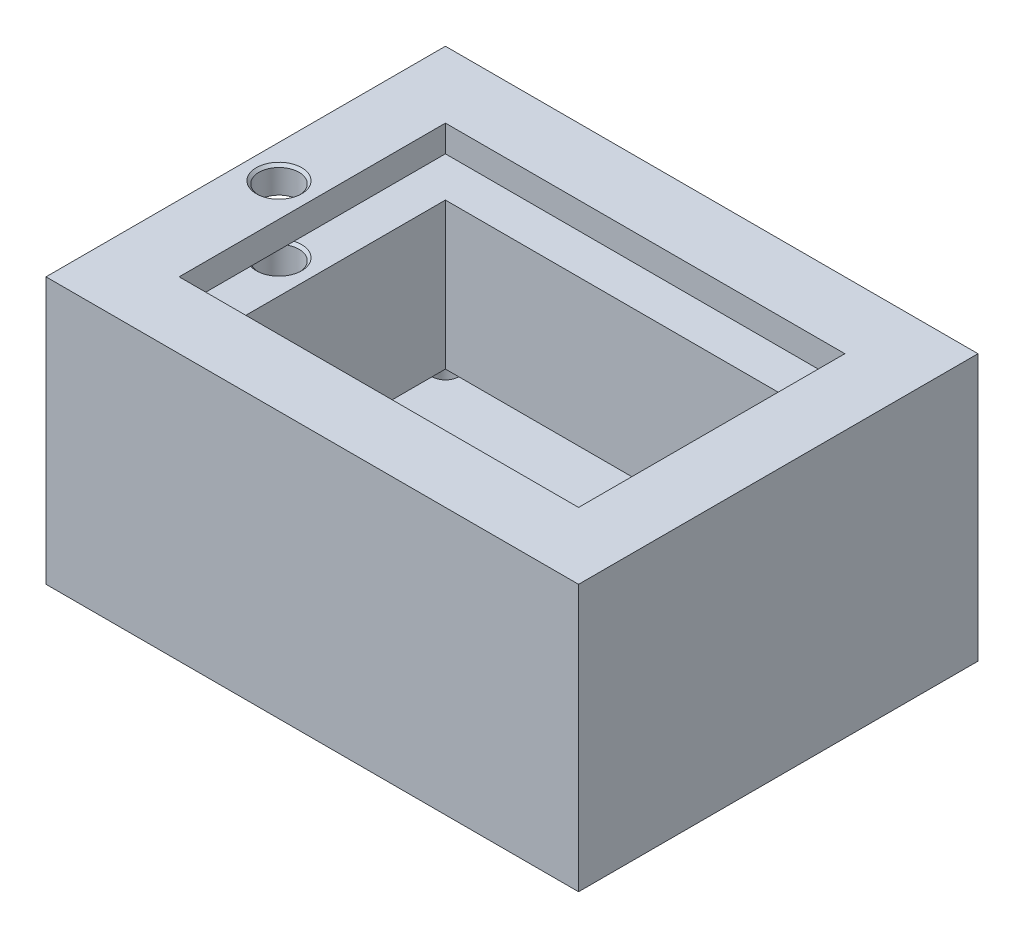
ISO-10303-21;
HEADER;
FILE_DESCRIPTION(('STEP AP214'),'2;1');
FILE_NAME('part.step','',(''),(''),'','','');
FILE_SCHEMA(('AUTOMOTIVE_DESIGN { 1 0 10303 214 1 1 1 1 }'));
ENDSEC;
DATA;
#1=APPLICATION_CONTEXT('core data for automotive mechanical design processes');
#2=APPLICATION_PROTOCOL_DEFINITION('international standard','automotive_design',2000,#1);
#3=PRODUCT_CONTEXT('',#1,'mechanical');
#4=PRODUCT('Part','Part','',(#3));
#5=PRODUCT_RELATED_PRODUCT_CATEGORY('part','',(#4));
#6=PRODUCT_DEFINITION_FORMATION('','',#4);
#7=PRODUCT_DEFINITION_CONTEXT('part definition',#1,'design');
#8=PRODUCT_DEFINITION('design','',#6,#7);
#9=PRODUCT_DEFINITION_SHAPE('','',#8);
#10=(LENGTH_UNIT() NAMED_UNIT(*) SI_UNIT(.MILLI.,.METRE.));
#11=(NAMED_UNIT(*) PLANE_ANGLE_UNIT() SI_UNIT($,.RADIAN.));
#12=(NAMED_UNIT(*) SI_UNIT($,.STERADIAN.) SOLID_ANGLE_UNIT());
#13=UNCERTAINTY_MEASURE_WITH_UNIT(LENGTH_MEASURE(1.E-05),#10,'distance_accuracy_value','');
#14=(GEOMETRIC_REPRESENTATION_CONTEXT(3) GLOBAL_UNCERTAINTY_ASSIGNED_CONTEXT((#13)) GLOBAL_UNIT_ASSIGNED_CONTEXT((#10,
#11,#12)) REPRESENTATION_CONTEXT('',''));
#15=CARTESIAN_POINT('',(0.,0.,0.));
#16=DIRECTION('',(0.,0.,1.));
#17=DIRECTION('',(1.,0.,0.));
#18=AXIS2_PLACEMENT_3D('',#15,#16,#17);
#19=CARTESIAN_POINT('',(19.05,5.08,12.7));
#20=DIRECTION('',(1.,0.,0.));
#21=DIRECTION('',(0.,0.,-1.));
#22=AXIS2_PLACEMENT_3D('',#19,#20,#21);
#23=PLANE('',#22);
#24=DIRECTION('',(0.,1.,0.));
#25=VECTOR('',#24,1.);
#26=CARTESIAN_POINT('',(19.05,5.08,-12.7));
#27=LINE('',#26,#25);
#28=CARTESIAN_POINT('',(19.05,22.86,-12.7));
#29=VERTEX_POINT('',#28);
#30=CARTESIAN_POINT('',(19.05,25.4,-12.7));
#31=VERTEX_POINT('',#30);
#32=EDGE_CURVE('E217',#29,#31,#27,.T.);
#33=ORIENTED_EDGE('',*,*,#32,.F.);
#34=DIRECTION('',(0.,0.,1.));
#35=VECTOR('',#34,1.);
#36=CARTESIAN_POINT('',(19.05,22.86,12.7));
#37=LINE('',#36,#35);
#38=CARTESIAN_POINT('',(19.05,22.86,12.7));
#39=VERTEX_POINT('',#38);
#40=EDGE_CURVE('E228',#29,#39,#37,.T.);
#41=ORIENTED_EDGE('',*,*,#40,.T.);
#42=DIRECTION('',(0.,1.,0.));
#43=VECTOR('',#42,1.);
#44=CARTESIAN_POINT('',(19.05,5.08,12.7));
#45=LINE('',#44,#43);
#46=CARTESIAN_POINT('',(19.05,25.4,12.7));
#47=VERTEX_POINT('',#46);
#48=EDGE_CURVE('E239',#39,#47,#45,.T.);
#49=ORIENTED_EDGE('',*,*,#48,.T.);
#50=DIRECTION('',(0.,0.,-1.));
#51=VECTOR('',#50,1.);
#52=CARTESIAN_POINT('',(19.05,25.4,12.7));
#53=LINE('',#52,#51);
#54=EDGE_CURVE('E222',#47,#31,#53,.T.);
#55=ORIENTED_EDGE('',*,*,#54,.T.);
#56=EDGE_LOOP('',(#33,#41,#49,#55));
#57=FACE_BOUND('',#56,.T.);
#58=ADVANCED_FACE('F45',(#57),#23,.F.);
#59=CARTESIAN_POINT('',(-19.05,5.08,12.7));
#60=DIRECTION('',(0.,0.,1.));
#61=DIRECTION('',(1.,0.,0.));
#62=AXIS2_PLACEMENT_3D('',#59,#60,#61);
#63=PLANE('',#62);
#64=ORIENTED_EDGE('',*,*,#48,.F.);
#65=DIRECTION('',(-1.,0.,0.));
#66=VECTOR('',#65,1.);
#67=CARTESIAN_POINT('',(-19.05,22.86,12.7));
#68=LINE('',#67,#66);
#69=CARTESIAN_POINT('',(-19.05,22.86,12.7));
#70=VERTEX_POINT('',#69);
#71=EDGE_CURVE('E365',#39,#70,#68,.T.);
#72=ORIENTED_EDGE('',*,*,#71,.T.);
#73=DIRECTION('',(0.,1.,0.));
#74=VECTOR('',#73,1.);
#75=CARTESIAN_POINT('',(-19.05,5.08,12.7));
#76=LINE('',#75,#74);
#77=CARTESIAN_POINT('',(-19.05,25.4,12.7));
#78=VERTEX_POINT('',#77);
#79=EDGE_CURVE('E242',#70,#78,#76,.T.);
#80=ORIENTED_EDGE('',*,*,#79,.T.);
#81=DIRECTION('',(1.,0.,0.));
#82=VECTOR('',#81,1.);
#83=CARTESIAN_POINT('',(-19.05,25.4,12.7));
#84=LINE('',#83,#82);
#85=EDGE_CURVE('E235',#78,#47,#84,.T.);
#86=ORIENTED_EDGE('',*,*,#85,.T.);
#87=EDGE_LOOP('',(#64,#72,#80,#86));
#88=FACE_BOUND('',#87,.T.);
#89=ADVANCED_FACE('F307',(#88),#63,.F.);
#90=CARTESIAN_POINT('',(-19.05,5.08,12.7));
#91=DIRECTION('',(-1.,0.,0.));
#92=DIRECTION('',(0.,0.,1.));
#93=AXIS2_PLACEMENT_3D('',#90,#91,#92);
#94=PLANE('',#93);
#95=ORIENTED_EDGE('',*,*,#79,.F.);
#96=DIRECTION('',(0.,0.,-1.));
#97=VECTOR('',#96,1.);
#98=CARTESIAN_POINT('',(-19.05,22.86,12.7));
#99=LINE('',#98,#97);
#100=CARTESIAN_POINT('',(-19.05,22.86,-12.7));
#101=VERTEX_POINT('',#100);
#102=EDGE_CURVE('E353',#70,#101,#99,.T.);
#103=ORIENTED_EDGE('',*,*,#102,.T.);
#104=DIRECTION('',(0.,1.,0.));
#105=VECTOR('',#104,1.);
#106=CARTESIAN_POINT('',(-19.05,5.08,-12.7));
#107=LINE('',#106,#105);
#108=CARTESIAN_POINT('',(-19.05,25.4,-12.7));
#109=VERTEX_POINT('',#108);
#110=EDGE_CURVE('E246',#101,#109,#107,.T.);
#111=ORIENTED_EDGE('',*,*,#110,.T.);
#112=DIRECTION('',(0.,0.,1.));
#113=VECTOR('',#112,1.);
#114=CARTESIAN_POINT('',(-19.05,25.4,12.7));
#115=LINE('',#114,#113);
#116=EDGE_CURVE('E230',#109,#78,#115,.T.);
#117=ORIENTED_EDGE('',*,*,#116,.T.);
#118=EDGE_LOOP('',(#95,#103,#111,#117));
#119=FACE_BOUND('',#118,.T.);
#120=ADVANCED_FACE('F320',(#119),#94,.F.);
#121=CARTESIAN_POINT('',(-19.05,5.08,-12.7));
#122=DIRECTION('',(0.,0.,-1.));
#123=DIRECTION('',(-1.,0.,0.));
#124=AXIS2_PLACEMENT_3D('',#121,#122,#123);
#125=PLANE('',#124);
#126=ORIENTED_EDGE('',*,*,#110,.F.);
#127=DIRECTION('',(1.,0.,0.));
#128=VECTOR('',#127,1.);
#129=CARTESIAN_POINT('',(-19.05,22.86,-12.7));
#130=LINE('',#129,#128);
#131=EDGE_CURVE('E278',#101,#29,#130,.T.);
#132=ORIENTED_EDGE('',*,*,#131,.T.);
#133=ORIENTED_EDGE('',*,*,#32,.T.);
#134=DIRECTION('',(-1.,0.,0.));
#135=VECTOR('',#134,1.);
#136=CARTESIAN_POINT('',(-19.05,25.4,-12.7));
#137=LINE('',#136,#135);
#138=EDGE_CURVE('E225',#31,#109,#137,.T.);
#139=ORIENTED_EDGE('',*,*,#138,.T.);
#140=EDGE_LOOP('',(#126,#132,#133,#139));
#141=FACE_BOUND('',#140,.T.);
#142=ADVANCED_FACE('F380',(#141),#125,.F.);
#143=CARTESIAN_POINT('',(25.4,25.4,19.05));
#144=DIRECTION('',(-1.,0.,0.));
#145=DIRECTION('',(0.,0.,1.));
#146=AXIS2_PLACEMENT_3D('',#143,#144,#145);
#147=PLANE('',#146);
#148=DIRECTION('',(0.,0.,-1.));
#149=VECTOR('',#148,1.);
#150=CARTESIAN_POINT('',(25.4,0.,19.05));
#151=LINE('',#150,#149);
#152=CARTESIAN_POINT('',(25.4,0.,19.05));
#153=VERTEX_POINT('',#152);
#154=CARTESIAN_POINT('',(25.4,0.,-19.05));
#155=VERTEX_POINT('',#154);
#156=EDGE_CURVE('E237',#153,#155,#151,.T.);
#157=ORIENTED_EDGE('',*,*,#156,.T.);
#158=DIRECTION('',(0.,-1.,0.));
#159=VECTOR('',#158,1.);
#160=CARTESIAN_POINT('',(25.4,25.4,-19.05));
#161=LINE('',#160,#159);
#162=CARTESIAN_POINT('',(25.4,25.4,-19.05));
#163=VERTEX_POINT('',#162);
#164=EDGE_CURVE('E273',#163,#155,#161,.T.);
#165=ORIENTED_EDGE('',*,*,#164,.F.);
#166=DIRECTION('',(0.,0.,-1.));
#167=VECTOR('',#166,1.);
#168=CARTESIAN_POINT('',(25.4,25.4,19.05));
#169=LINE('',#168,#167);
#170=CARTESIAN_POINT('',(25.4,25.4,19.05));
#171=VERTEX_POINT('',#170);
#172=EDGE_CURVE('E248',#171,#163,#169,.T.);
#173=ORIENTED_EDGE('',*,*,#172,.F.);
#174=DIRECTION('',(0.,-1.,0.));
#175=VECTOR('',#174,1.);
#176=CARTESIAN_POINT('',(25.4,25.4,19.05));
#177=LINE('',#176,#175);
#178=EDGE_CURVE('E256',#171,#153,#177,.T.);
#179=ORIENTED_EDGE('',*,*,#178,.T.);
#180=EDGE_LOOP('',(#157,#165,#173,#179));
#181=FACE_BOUND('',#180,.T.);
#182=ADVANCED_FACE('F383',(#181),#147,.F.);
#183=CARTESIAN_POINT('',(-25.4,25.4,-19.05));
#184=DIRECTION('',(0.,0.,1.));
#185=DIRECTION('',(1.,0.,0.));
#186=AXIS2_PLACEMENT_3D('',#183,#184,#185);
#187=PLANE('',#186);
#188=DIRECTION('',(-1.,0.,0.));
#189=VECTOR('',#188,1.);
#190=CARTESIAN_POINT('',(-25.4,0.,-19.05));
#191=LINE('',#190,#189);
#192=CARTESIAN_POINT('',(-25.4,0.,-19.05));
#193=VERTEX_POINT('',#192);
#194=EDGE_CURVE('E261',#155,#193,#191,.T.);
#195=ORIENTED_EDGE('',*,*,#194,.T.);
#196=DIRECTION('',(0.,-1.,0.));
#197=VECTOR('',#196,1.);
#198=CARTESIAN_POINT('',(-25.4,25.4,-19.05));
#199=LINE('',#198,#197);
#200=CARTESIAN_POINT('',(-25.4,25.4,-19.05));
#201=VERTEX_POINT('',#200);
#202=EDGE_CURVE('E275',#201,#193,#199,.T.);
#203=ORIENTED_EDGE('',*,*,#202,.F.);
#204=DIRECTION('',(-1.,0.,0.));
#205=VECTOR('',#204,1.);
#206=CARTESIAN_POINT('',(-25.4,25.4,-19.05));
#207=LINE('',#206,#205);
#208=EDGE_CURVE('E255',#163,#201,#207,.T.);
#209=ORIENTED_EDGE('',*,*,#208,.F.);
#210=ORIENTED_EDGE('',*,*,#164,.T.);
#211=EDGE_LOOP('',(#195,#203,#209,#210));
#212=FACE_BOUND('',#211,.T.);
#213=ADVANCED_FACE('F511',(#212),#187,.F.);
#214=CARTESIAN_POINT('',(-25.4,25.4,19.05));
#215=DIRECTION('',(1.,0.,0.));
#216=DIRECTION('',(0.,0.,-1.));
#217=AXIS2_PLACEMENT_3D('',#214,#215,#216);
#218=PLANE('',#217);
#219=DIRECTION('',(0.,0.,1.));
#220=VECTOR('',#219,1.);
#221=CARTESIAN_POINT('',(-25.4,19.04238,16.51762));
#222=LINE('',#221,#220);
#223=CARTESIAN_POINT('',(-25.4,19.04238,-16.51762));
#224=VERTEX_POINT('',#223);
#225=CARTESIAN_POINT('',(-25.4,19.04238,16.51762));
#226=VERTEX_POINT('',#225);
#227=EDGE_CURVE('E441',#224,#226,#222,.T.);
#228=ORIENTED_EDGE('',*,*,#227,.F.);
#229=DIRECTION('',(0.,-1.,0.));
#230=VECTOR('',#229,1.);
#231=CARTESIAN_POINT('',(-25.4,19.04238,-16.51762));
#232=LINE('',#231,#230);
#233=CARTESIAN_POINT('',(-25.4,22.86,-16.51762));
#234=VERTEX_POINT('',#233);
#235=EDGE_CURVE('E424',#234,#224,#232,.T.);
#236=ORIENTED_EDGE('',*,*,#235,.F.);
#237=DIRECTION('',(0.,0.,-1.));
#238=VECTOR('',#237,1.);
#239=CARTESIAN_POINT('',(-25.4,22.86,-16.51762));
#240=LINE('',#239,#238);
#241=CARTESIAN_POINT('',(-25.4,22.86,16.51762));
#242=VERTEX_POINT('',#241);
#243=EDGE_CURVE('E427',#242,#234,#240,.T.);
#244=ORIENTED_EDGE('',*,*,#243,.F.);
#245=DIRECTION('',(0.,1.,0.));
#246=VECTOR('',#245,1.);
#247=CARTESIAN_POINT('',(-25.4,22.86,16.51762));
#248=LINE('',#247,#246);
#249=EDGE_CURVE('E443',#226,#242,#248,.T.);
#250=ORIENTED_EDGE('',*,*,#249,.F.);
#251=EDGE_LOOP('',(#228,#236,#244,#250));
#252=FACE_BOUND('',#251,.T.);
#253=DIRECTION('',(0.,0.,1.));
#254=VECTOR('',#253,1.);
#255=CARTESIAN_POINT('',(-25.4,0.,19.05));
#256=LINE('',#255,#254);
#257=CARTESIAN_POINT('',(-25.4,0.,19.05));
#258=VERTEX_POINT('',#257);
#259=EDGE_CURVE('E263',#193,#258,#256,.T.);
#260=ORIENTED_EDGE('',*,*,#259,.T.);
#261=DIRECTION('',(0.,-1.,0.));
#262=VECTOR('',#261,1.);
#263=CARTESIAN_POINT('',(-25.4,25.4,19.05));
#264=LINE('',#263,#262);
#265=CARTESIAN_POINT('',(-25.4,25.4,19.05));
#266=VERTEX_POINT('',#265);
#267=EDGE_CURVE('E268',#266,#258,#264,.T.);
#268=ORIENTED_EDGE('',*,*,#267,.F.);
#269=DIRECTION('',(0.,0.,1.));
#270=VECTOR('',#269,1.);
#271=CARTESIAN_POINT('',(-25.4,25.4,19.05));
#272=LINE('',#271,#270);
#273=EDGE_CURVE('E253',#201,#266,#272,.T.);
#274=ORIENTED_EDGE('',*,*,#273,.F.);
#275=ORIENTED_EDGE('',*,*,#202,.T.);
#276=EDGE_LOOP('',(#260,#268,#274,#275));
#277=FACE_BOUND('',#276,.T.);
#278=ADVANCED_FACE('F461',(#252,#277),#218,.F.);
#279=CARTESIAN_POINT('',(-25.4,25.4,19.05));
#280=DIRECTION('',(0.,0.,-1.));
#281=DIRECTION('',(-1.,0.,0.));
#282=AXIS2_PLACEMENT_3D('',#279,#280,#281);
#283=PLANE('',#282);
#284=DIRECTION('',(1.,0.,0.));
#285=VECTOR('',#284,1.);
#286=CARTESIAN_POINT('',(-25.4,0.,19.05));
#287=LINE('',#286,#285);
#288=EDGE_CURVE('E254',#258,#153,#287,.T.);
#289=ORIENTED_EDGE('',*,*,#288,.T.);
#290=ORIENTED_EDGE('',*,*,#178,.F.);
#291=DIRECTION('',(1.,0.,0.));
#292=VECTOR('',#291,1.);
#293=CARTESIAN_POINT('',(-25.4,25.4,19.05));
#294=LINE('',#293,#292);
#295=EDGE_CURVE('E260',#266,#171,#294,.T.);
#296=ORIENTED_EDGE('',*,*,#295,.F.);
#297=ORIENTED_EDGE('',*,*,#267,.T.);
#298=EDGE_LOOP('',(#289,#290,#296,#297));
#299=FACE_BOUND('',#298,.T.);
#300=ADVANCED_FACE('F514',(#299),#283,.F.);
#301=CARTESIAN_POINT('',(0.,25.4,0.));
#302=DIRECTION('',(0.,-1.,0.));
#303=DIRECTION('',(0.,0.,-1.));
#304=AXIS2_PLACEMENT_3D('',#301,#302,#303);
#305=PLANE('',#304);
#306=CARTESIAN_POINT('',(-22.225,25.4,0.));
#307=DIRECTION('',(0.,-1.,0.));
#308=DIRECTION('',(0.,0.,-1.));
#309=AXIS2_PLACEMENT_3D('',#306,#307,#308);
#310=CIRCLE('',#309,2.16281);
#311=CARTESIAN_POINT('',(-22.225,25.4,-2.16281000000001));
#312=VERTEX_POINT('',#311);
#313=EDGE_CURVE('E286',#312,#312,#310,.T.);
#314=ORIENTED_EDGE('',*,*,#313,.T.);
#315=EDGE_LOOP('',(#314));
#316=FACE_BOUND('',#315,.T.);
#317=ORIENTED_EDGE('',*,*,#138,.F.);
#318=ORIENTED_EDGE('',*,*,#54,.F.);
#319=ORIENTED_EDGE('',*,*,#85,.F.);
#320=ORIENTED_EDGE('',*,*,#116,.F.);
#321=EDGE_LOOP('',(#317,#318,#319,#320));
#322=FACE_BOUND('',#321,.T.);
#323=ORIENTED_EDGE('',*,*,#172,.T.);
#324=ORIENTED_EDGE('',*,*,#208,.T.);
#325=ORIENTED_EDGE('',*,*,#273,.T.);
#326=ORIENTED_EDGE('',*,*,#295,.T.);
#327=EDGE_LOOP('',(#323,#324,#325,#326));
#328=FACE_BOUND('',#327,.T.);
#329=ADVANCED_FACE('F373',(#316,#322,#328),#305,.F.);
#330=CARTESIAN_POINT('',(0.,0.,0.));
#331=DIRECTION('',(0.,-1.,0.));
#332=DIRECTION('',(0.,0.,-1.));
#333=AXIS2_PLACEMENT_3D('',#330,#331,#332);
#334=PLANE('',#333);
#335=CARTESIAN_POINT('',(19.05,0.,-12.7));
#336=DIRECTION('',(0.,-1.,0.));
#337=DIRECTION('',(0.,0.,-1.));
#338=AXIS2_PLACEMENT_3D('',#335,#336,#337);
#339=CIRCLE('',#338,1.27);
#340=CARTESIAN_POINT('',(19.05,0.,-13.97));
#341=VERTEX_POINT('',#340);
#342=EDGE_CURVE('E409',#341,#341,#339,.F.);
#343=ORIENTED_EDGE('',*,*,#342,.T.);
#344=EDGE_LOOP('',(#343));
#345=FACE_BOUND('',#344,.T.);
#346=CARTESIAN_POINT('',(-19.05,0.,12.7));
#347=DIRECTION('',(0.,-1.,0.));
#348=DIRECTION('',(0.,0.,-1.));
#349=AXIS2_PLACEMENT_3D('',#346,#347,#348);
#350=CIRCLE('',#349,1.27);
#351=CARTESIAN_POINT('',(-19.05,0.,11.43));
#352=VERTEX_POINT('',#351);
#353=EDGE_CURVE('E415',#352,#352,#350,.F.);
#354=ORIENTED_EDGE('',*,*,#353,.T.);
#355=EDGE_LOOP('',(#354));
#356=FACE_BOUND('',#355,.T.);
#357=CARTESIAN_POINT('',(19.05,0.,12.7));
#358=DIRECTION('',(0.,-1.,0.));
#359=DIRECTION('',(0.,0.,-1.));
#360=AXIS2_PLACEMENT_3D('',#357,#358,#359);
#361=CIRCLE('',#360,1.27);
#362=CARTESIAN_POINT('',(19.05,0.,11.43));
#363=VERTEX_POINT('',#362);
#364=EDGE_CURVE('E404',#363,#363,#361,.F.);
#365=ORIENTED_EDGE('',*,*,#364,.T.);
#366=EDGE_LOOP('',(#365));
#367=FACE_BOUND('',#366,.T.);
#368=CARTESIAN_POINT('',(-19.05,0.,-12.7));
#369=DIRECTION('',(0.,-1.,0.));
#370=DIRECTION('',(0.,0.,-1.));
#371=AXIS2_PLACEMENT_3D('',#368,#369,#370);
#372=CIRCLE('',#371,1.27);
#373=CARTESIAN_POINT('',(-19.05,0.,-13.97));
#374=VERTEX_POINT('',#373);
#375=EDGE_CURVE('E187',#374,#374,#372,.F.);
#376=ORIENTED_EDGE('',*,*,#375,.T.);
#377=EDGE_LOOP('',(#376));
#378=FACE_BOUND('',#377,.T.);
#379=ORIENTED_EDGE('',*,*,#156,.F.);
#380=ORIENTED_EDGE('',*,*,#288,.F.);
#381=ORIENTED_EDGE('',*,*,#259,.F.);
#382=ORIENTED_EDGE('',*,*,#194,.F.);
#383=EDGE_LOOP('',(#379,#380,#381,#382));
#384=FACE_BOUND('',#383,.T.);
#385=ADVANCED_FACE('F474',(#345,#356,#367,#378,#384),#334,.T.);
#386=CARTESIAN_POINT('',(22.87524,22.86,-16.51762));
#387=DIRECTION('',(0.,1.,0.));
#388=DIRECTION('',(0.,0.,1.));
#389=AXIS2_PLACEMENT_3D('',#386,#387,#388);
#390=PLANE('',#389);
#391=CARTESIAN_POINT('',(-22.225,22.86,0.));
#392=DIRECTION('',(0.,1.,0.));
#393=DIRECTION('',(0.,0.,1.));
#394=AXIS2_PLACEMENT_3D('',#391,#392,#393);
#395=CIRCLE('',#394,1.90881);
#396=CARTESIAN_POINT('',(-22.225,22.86,1.90881));
#397=VERTEX_POINT('',#396);
#398=EDGE_CURVE('E422',#397,#397,#395,.T.);
#399=ORIENTED_EDGE('',*,*,#398,.T.);
#400=EDGE_LOOP('',(#399));
#401=FACE_BOUND('',#400,.T.);
#402=ORIENTED_EDGE('',*,*,#243,.T.);
#403=DIRECTION('',(-1.,0.,0.));
#404=VECTOR('',#403,1.);
#405=CARTESIAN_POINT('',(22.87524,22.86,-16.51762));
#406=LINE('',#405,#404);
#407=CARTESIAN_POINT('',(22.87524,22.86,-16.51762));
#408=VERTEX_POINT('',#407);
#409=EDGE_CURVE('E358',#408,#234,#406,.T.);
#410=ORIENTED_EDGE('',*,*,#409,.F.);
#411=DIRECTION('',(0.,0.,-1.));
#412=VECTOR('',#411,1.);
#413=CARTESIAN_POINT('',(22.87524,22.86,-16.51762));
#414=LINE('',#413,#412);
#415=CARTESIAN_POINT('',(22.87524,22.86,16.51762));
#416=VERTEX_POINT('',#415);
#417=EDGE_CURVE('E436',#416,#408,#414,.T.);
#418=ORIENTED_EDGE('',*,*,#417,.F.);
#419=DIRECTION('',(-1.,0.,0.));
#420=VECTOR('',#419,1.);
#421=CARTESIAN_POINT('',(22.87524,22.86,16.51762));
#422=LINE('',#421,#420);
#423=EDGE_CURVE('E448',#416,#242,#422,.T.);
#424=ORIENTED_EDGE('',*,*,#423,.T.);
#425=EDGE_LOOP('',(#402,#410,#418,#424));
#426=FACE_BOUND('',#425,.T.);
#427=ORIENTED_EDGE('',*,*,#131,.F.);
#428=ORIENTED_EDGE('',*,*,#102,.F.);
#429=ORIENTED_EDGE('',*,*,#71,.F.);
#430=ORIENTED_EDGE('',*,*,#40,.F.);
#431=EDGE_LOOP('',(#427,#428,#429,#430));
#432=FACE_BOUND('',#431,.T.);
#433=ADVANCED_FACE('F377',(#401,#426,#432),#390,.F.);
#434=CARTESIAN_POINT('',(22.87524,19.04238,16.51762));
#435=DIRECTION('',(0.,-1.,0.));
#436=DIRECTION('',(0.,0.,-1.));
#437=AXIS2_PLACEMENT_3D('',#434,#435,#436);
#438=PLANE('',#437);
#439=CARTESIAN_POINT('',(-22.225,19.04238,0.));
#440=DIRECTION('',(0.,-1.,0.));
#441=DIRECTION('',(0.,0.,-1.));
#442=AXIS2_PLACEMENT_3D('',#439,#440,#441);
#443=CIRCLE('',#442,2.16280999999999);
#444=CARTESIAN_POINT('',(-22.225,19.04238,-2.16281));
#445=VERTEX_POINT('',#444);
#446=EDGE_CURVE('E51',#445,#445,#443,.T.);
#447=ORIENTED_EDGE('',*,*,#446,.T.);
#448=EDGE_LOOP('',(#447));
#449=FACE_BOUND('',#448,.T.);
#450=ORIENTED_EDGE('',*,*,#227,.T.);
#451=DIRECTION('',(-1.,0.,0.));
#452=VECTOR('',#451,1.);
#453=CARTESIAN_POINT('',(22.87524,19.04238,16.51762));
#454=LINE('',#453,#452);
#455=CARTESIAN_POINT('',(22.87524,19.04238,16.51762));
#456=VERTEX_POINT('',#455);
#457=EDGE_CURVE('E455',#456,#226,#454,.T.);
#458=ORIENTED_EDGE('',*,*,#457,.F.);
#459=DIRECTION('',(0.,0.,1.));
#460=VECTOR('',#459,1.);
#461=CARTESIAN_POINT('',(22.87524,19.04238,16.51762));
#462=LINE('',#461,#460);
#463=CARTESIAN_POINT('',(22.87524,19.04238,-16.51762));
#464=VERTEX_POINT('',#463);
#465=EDGE_CURVE('E429',#464,#456,#462,.T.);
#466=ORIENTED_EDGE('',*,*,#465,.F.);
#467=DIRECTION('',(-1.,0.,0.));
#468=VECTOR('',#467,1.);
#469=CARTESIAN_POINT('',(22.87524,19.04238,-16.51762));
#470=LINE('',#469,#468);
#471=EDGE_CURVE('E437',#464,#224,#470,.T.);
#472=ORIENTED_EDGE('',*,*,#471,.T.);
#473=EDGE_LOOP('',(#450,#458,#466,#472));
#474=FACE_BOUND('',#473,.T.);
#475=DIRECTION('',(1.,0.,0.));
#476=VECTOR('',#475,1.);
#477=CARTESIAN_POINT('',(-19.05,19.04238,12.7));
#478=LINE('',#477,#476);
#479=CARTESIAN_POINT('',(-19.05,19.04238,12.7));
#480=VERTEX_POINT('',#479);
#481=CARTESIAN_POINT('',(19.05,19.04238,12.7));
#482=VERTEX_POINT('',#481);
#483=EDGE_CURVE('E346',#480,#482,#478,.T.);
#484=ORIENTED_EDGE('',*,*,#483,.F.);
#485=DIRECTION('',(0.,0.,1.));
#486=VECTOR('',#485,1.);
#487=CARTESIAN_POINT('',(-19.05,19.04238,12.7));
#488=LINE('',#487,#486);
#489=CARTESIAN_POINT('',(-19.05,19.04238,-12.7));
#490=VERTEX_POINT('',#489);
#491=EDGE_CURVE('E352',#490,#480,#488,.T.);
#492=ORIENTED_EDGE('',*,*,#491,.F.);
#493=DIRECTION('',(-1.,0.,0.));
#494=VECTOR('',#493,1.);
#495=CARTESIAN_POINT('',(-19.05,19.04238,-12.7));
#496=LINE('',#495,#494);
#497=CARTESIAN_POINT('',(19.05,19.04238,-12.7));
#498=VERTEX_POINT('',#497);
#499=EDGE_CURVE('E279',#498,#490,#496,.T.);
#500=ORIENTED_EDGE('',*,*,#499,.F.);
#501=DIRECTION('',(0.,0.,-1.));
#502=VECTOR('',#501,1.);
#503=CARTESIAN_POINT('',(19.05,19.04238,12.7));
#504=LINE('',#503,#502);
#505=EDGE_CURVE('E338',#482,#498,#504,.T.);
#506=ORIENTED_EDGE('',*,*,#505,.F.);
#507=EDGE_LOOP('',(#484,#492,#500,#506));
#508=FACE_BOUND('',#507,.T.);
#509=ADVANCED_FACE('F293',(#449,#474,#508),#438,.F.);
#510=CARTESIAN_POINT('',(22.87524,19.04238,-16.51762));
#511=DIRECTION('',(0.,0.,-1.));
#512=DIRECTION('',(-1.,0.,0.));
#513=AXIS2_PLACEMENT_3D('',#510,#511,#512);
#514=PLANE('',#513);
#515=ORIENTED_EDGE('',*,*,#235,.T.);
#516=ORIENTED_EDGE('',*,*,#471,.F.);
#517=DIRECTION('',(0.,-1.,0.));
#518=VECTOR('',#517,1.);
#519=CARTESIAN_POINT('',(22.87524,19.04238,-16.51762));
#520=LINE('',#519,#518);
#521=EDGE_CURVE('E428',#408,#464,#520,.T.);
#522=ORIENTED_EDGE('',*,*,#521,.F.);
#523=ORIENTED_EDGE('',*,*,#409,.T.);
#524=EDGE_LOOP('',(#515,#516,#522,#523));
#525=FACE_BOUND('',#524,.T.);
#526=ADVANCED_FACE('F468',(#525),#514,.F.);
#527=CARTESIAN_POINT('',(22.87524,22.86,16.51762));
#528=DIRECTION('',(0.,0.,1.));
#529=DIRECTION('',(1.,0.,0.));
#530=AXIS2_PLACEMENT_3D('',#527,#528,#529);
#531=PLANE('',#530);
#532=ORIENTED_EDGE('',*,*,#249,.T.);
#533=ORIENTED_EDGE('',*,*,#423,.F.);
#534=DIRECTION('',(0.,1.,0.));
#535=VECTOR('',#534,1.);
#536=CARTESIAN_POINT('',(22.87524,22.86,16.51762));
#537=LINE('',#536,#535);
#538=EDGE_CURVE('E433',#456,#416,#537,.T.);
#539=ORIENTED_EDGE('',*,*,#538,.F.);
#540=ORIENTED_EDGE('',*,*,#457,.T.);
#541=EDGE_LOOP('',(#532,#533,#539,#540));
#542=FACE_BOUND('',#541,.T.);
#543=ADVANCED_FACE('F465',(#542),#531,.F.);
#544=CARTESIAN_POINT('',(22.87524,0.,0.));
#545=DIRECTION('',(1.,0.,0.));
#546=DIRECTION('',(0.,0.,-1.));
#547=AXIS2_PLACEMENT_3D('',#544,#545,#546);
#548=PLANE('',#547);
#549=ORIENTED_EDGE('',*,*,#521,.T.);
#550=ORIENTED_EDGE('',*,*,#465,.T.);
#551=ORIENTED_EDGE('',*,*,#538,.T.);
#552=ORIENTED_EDGE('',*,*,#417,.T.);
#553=EDGE_LOOP('',(#549,#550,#551,#552));
#554=FACE_BOUND('',#553,.T.);
#555=ADVANCED_FACE('F469',(#554),#548,.F.);
#556=CARTESIAN_POINT('',(0.,5.08,0.));
#557=DIRECTION('',(0.,-1.,0.));
#558=DIRECTION('',(0.,0.,-1.));
#559=AXIS2_PLACEMENT_3D('',#556,#557,#558);
#560=PLANE('',#559);
#561=CARTESIAN_POINT('',(19.05,5.08,-12.7));
#562=DIRECTION('',(0.,1.,0.));
#563=DIRECTION('',(0.,0.,1.));
#564=AXIS2_PLACEMENT_3D('',#561,#562,#563);
#565=CIRCLE('',#564,1.27);
#566=CARTESIAN_POINT('',(17.78,5.08,-12.7));
#567=VERTEX_POINT('',#566);
#568=CARTESIAN_POINT('',(19.05,5.08,-11.43));
#569=VERTEX_POINT('',#568);
#570=EDGE_CURVE('E209',#567,#569,#565,.T.);
#571=ORIENTED_EDGE('',*,*,#570,.F.);
#572=DIRECTION('',(-1.,0.,0.));
#573=VECTOR('',#572,1.);
#574=CARTESIAN_POINT('',(-19.05,5.08,-12.7));
#575=LINE('',#574,#573);
#576=CARTESIAN_POINT('',(-17.78,5.08,-12.7));
#577=VERTEX_POINT('',#576);
#578=EDGE_CURVE('E198',#567,#577,#575,.T.);
#579=ORIENTED_EDGE('',*,*,#578,.T.);
#580=CARTESIAN_POINT('',(-19.05,5.08,-12.7));
#581=DIRECTION('',(0.,1.,0.));
#582=DIRECTION('',(0.,0.,1.));
#583=AXIS2_PLACEMENT_3D('',#580,#581,#582);
#584=CIRCLE('',#583,1.27);
#585=CARTESIAN_POINT('',(-19.05,5.08,-11.43));
#586=VERTEX_POINT('',#585);
#587=EDGE_CURVE('E184',#586,#577,#584,.T.);
#588=ORIENTED_EDGE('',*,*,#587,.F.);
#589=DIRECTION('',(0.,0.,1.));
#590=VECTOR('',#589,1.);
#591=CARTESIAN_POINT('',(-19.05,5.08,12.7));
#592=LINE('',#591,#590);
#593=CARTESIAN_POINT('',(-19.05,5.08,11.43));
#594=VERTEX_POINT('',#593);
#595=EDGE_CURVE('E216',#586,#594,#592,.T.);
#596=ORIENTED_EDGE('',*,*,#595,.T.);
#597=CARTESIAN_POINT('',(-19.05,5.08,12.7));
#598=DIRECTION('',(0.,1.,0.));
#599=DIRECTION('',(0.,0.,1.));
#600=AXIS2_PLACEMENT_3D('',#597,#598,#599);
#601=CIRCLE('',#600,1.27);
#602=CARTESIAN_POINT('',(-17.78,5.08,12.7));
#603=VERTEX_POINT('',#602);
#604=EDGE_CURVE('E416',#603,#594,#601,.T.);
#605=ORIENTED_EDGE('',*,*,#604,.F.);
#606=DIRECTION('',(1.,0.,0.));
#607=VECTOR('',#606,1.);
#608=CARTESIAN_POINT('',(-19.05,5.08,12.7));
#609=LINE('',#608,#607);
#610=CARTESIAN_POINT('',(17.78,5.08,12.7));
#611=VERTEX_POINT('',#610);
#612=EDGE_CURVE('E221',#603,#611,#609,.T.);
#613=ORIENTED_EDGE('',*,*,#612,.T.);
#614=CARTESIAN_POINT('',(19.05,5.08,12.7));
#615=DIRECTION('',(0.,1.,0.));
#616=DIRECTION('',(0.,0.,1.));
#617=AXIS2_PLACEMENT_3D('',#614,#615,#616);
#618=CIRCLE('',#617,1.27);
#619=CARTESIAN_POINT('',(19.05,5.08,11.43));
#620=VERTEX_POINT('',#619);
#621=EDGE_CURVE('E402',#620,#611,#618,.T.);
#622=ORIENTED_EDGE('',*,*,#621,.F.);
#623=DIRECTION('',(0.,0.,-1.));
#624=VECTOR('',#623,1.);
#625=CARTESIAN_POINT('',(19.05,5.08,12.7));
#626=LINE('',#625,#624);
#627=EDGE_CURVE('E651',#620,#569,#626,.T.);
#628=ORIENTED_EDGE('',*,*,#627,.T.);
#629=EDGE_LOOP('',(#571,#579,#588,#596,#605,#613,#622,#628));
#630=FACE_BOUND('',#629,.T.);
#631=ADVANCED_FACE('F210',(#630),#560,.F.);
#632=CARTESIAN_POINT('',(19.05,5.08,-12.7));
#633=VERTEX_POINT('',#632);
#634=EDGE_CURVE('E250',#633,#498,#27,.T.);
#635=ORIENTED_EDGE('',*,*,#634,.T.);
#636=ORIENTED_EDGE('',*,*,#499,.T.);
#637=CARTESIAN_POINT('',(-19.05,5.08,-12.7));
#638=VERTEX_POINT('',#637);
#639=EDGE_CURVE('E202',#638,#490,#107,.T.);
#640=ORIENTED_EDGE('',*,*,#639,.F.);
#641=EDGE_CURVE('E179',#577,#638,#575,.T.);
#642=ORIENTED_EDGE('',*,*,#641,.F.);
#643=ORIENTED_EDGE('',*,*,#578,.F.);
#644=EDGE_CURVE('E205',#633,#567,#575,.T.);
#645=ORIENTED_EDGE('',*,*,#644,.F.);
#646=EDGE_LOOP('',(#635,#636,#640,#642,#643,#645));
#647=FACE_BOUND('',#646,.T.);
#648=ADVANCED_FACE('F196',(#647),#125,.F.);
#649=ORIENTED_EDGE('',*,*,#639,.T.);
#650=ORIENTED_EDGE('',*,*,#491,.T.);
#651=CARTESIAN_POINT('',(-19.05,5.08,12.7));
#652=VERTEX_POINT('',#651);
#653=EDGE_CURVE('E241',#652,#480,#76,.T.);
#654=ORIENTED_EDGE('',*,*,#653,.F.);
#655=EDGE_CURVE('E212',#594,#652,#592,.T.);
#656=ORIENTED_EDGE('',*,*,#655,.F.);
#657=ORIENTED_EDGE('',*,*,#595,.F.);
#658=EDGE_CURVE('E182',#638,#586,#592,.T.);
#659=ORIENTED_EDGE('',*,*,#658,.F.);
#660=EDGE_LOOP('',(#649,#650,#654,#656,#657,#659));
#661=FACE_BOUND('',#660,.T.);
#662=ADVANCED_FACE('F333',(#661),#94,.F.);
#663=ORIENTED_EDGE('',*,*,#653,.T.);
#664=ORIENTED_EDGE('',*,*,#483,.T.);
#665=CARTESIAN_POINT('',(19.05,5.08,12.7));
#666=VERTEX_POINT('',#665);
#667=EDGE_CURVE('E236',#666,#482,#45,.T.);
#668=ORIENTED_EDGE('',*,*,#667,.F.);
#669=EDGE_CURVE('E219',#611,#666,#609,.T.);
#670=ORIENTED_EDGE('',*,*,#669,.F.);
#671=ORIENTED_EDGE('',*,*,#612,.F.);
#672=EDGE_CURVE('E220',#652,#603,#609,.T.);
#673=ORIENTED_EDGE('',*,*,#672,.F.);
#674=EDGE_LOOP('',(#663,#664,#668,#670,#671,#673));
#675=FACE_BOUND('',#674,.T.);
#676=ADVANCED_FACE('F318',(#675),#63,.F.);
#677=ORIENTED_EDGE('',*,*,#667,.T.);
#678=ORIENTED_EDGE('',*,*,#505,.T.);
#679=ORIENTED_EDGE('',*,*,#634,.F.);
#680=EDGE_CURVE('E232',#569,#633,#626,.T.);
#681=ORIENTED_EDGE('',*,*,#680,.F.);
#682=ORIENTED_EDGE('',*,*,#627,.F.);
#683=EDGE_CURVE('E204',#666,#620,#626,.T.);
#684=ORIENTED_EDGE('',*,*,#683,.F.);
#685=EDGE_LOOP('',(#677,#678,#679,#681,#682,#684));
#686=FACE_BOUND('',#685,.T.);
#687=ADVANCED_FACE('F315',(#686),#23,.F.);
#688=CARTESIAN_POINT('',(-22.225,15.24,0.));
#689=DIRECTION('',(0.,1.,0.));
#690=DIRECTION('',(0.,0.,1.));
#691=AXIS2_PLACEMENT_3D('',#688,#689,#690);
#692=PLANE('',#691);
#693=CARTESIAN_POINT('',(-22.225,15.24,0.));
#694=DIRECTION('',(0.,1.,0.));
#695=DIRECTION('',(0.,0.,1.));
#696=AXIS2_PLACEMENT_3D('',#693,#694,#695);
#697=CIRCLE('',#696,1.90881);
#698=CARTESIAN_POINT('',(-22.225,15.24,1.90881));
#699=VERTEX_POINT('',#698);
#700=EDGE_CURVE('E194',#699,#699,#697,.T.);
#701=ORIENTED_EDGE('',*,*,#700,.T.);
#702=EDGE_LOOP('',(#701));
#703=FACE_BOUND('',#702,.T.);
#704=ADVANCED_FACE('F323',(#703),#692,.T.);
#705=CARTESIAN_POINT('',(-22.225,15.24,0.));
#706=DIRECTION('',(0.,1.,0.));
#707=DIRECTION('',(0.,0.,1.));
#708=AXIS2_PLACEMENT_3D('',#705,#706,#707);
#709=CYLINDRICAL_SURFACE('',#708,1.90881);
#710=CARTESIAN_POINT('',(-22.225,18.78838,0.));
#711=DIRECTION('',(0.,-1.,0.));
#712=DIRECTION('',(0.,0.,-1.));
#713=AXIS2_PLACEMENT_3D('',#710,#711,#712);
#714=CIRCLE('',#713,1.90881);
#715=CARTESIAN_POINT('',(-22.225,18.78838,-1.90881000000001));
#716=VERTEX_POINT('',#715);
#717=EDGE_CURVE('E11',#716,#716,#714,.F.);
#718=ORIENTED_EDGE('',*,*,#717,.T.);
#719=EDGE_LOOP('',(#718));
#720=FACE_BOUND('',#719,.T.);
#721=ORIENTED_EDGE('',*,*,#700,.F.);
#722=EDGE_LOOP('',(#721));
#723=FACE_BOUND('',#722,.T.);
#724=ADVANCED_FACE('F331',(#720,#723),#709,.F.);
#725=CARTESIAN_POINT('',(-22.225,25.146,0.));
#726=DIRECTION('',(0.,-1.,0.));
#727=DIRECTION('',(0.,0.,-1.));
#728=AXIS2_PLACEMENT_3D('',#725,#726,#727);
#729=CIRCLE('',#728,1.90881);
#730=CARTESIAN_POINT('',(-22.225,25.146,-1.90881000000001));
#731=VERTEX_POINT('',#730);
#732=EDGE_CURVE('E285',#731,#731,#729,.F.);
#733=ORIENTED_EDGE('',*,*,#732,.T.);
#734=EDGE_LOOP('',(#733));
#735=FACE_BOUND('',#734,.T.);
#736=ORIENTED_EDGE('',*,*,#398,.F.);
#737=EDGE_LOOP('',(#736));
#738=FACE_BOUND('',#737,.T.);
#739=ADVANCED_FACE('F304',(#735,#738),#709,.F.);
#740=CARTESIAN_POINT('',(-22.225,25.146,0.));
#741=DIRECTION('',(0.,1.,0.));
#742=DIRECTION('',(0.,0.,1.));
#743=AXIS2_PLACEMENT_3D('',#740,#741,#742);
#744=CONICAL_SURFACE('',#743,1.90881,0.785398163397445);
#745=ORIENTED_EDGE('',*,*,#313,.F.);
#746=EDGE_LOOP('',(#745));
#747=FACE_BOUND('',#746,.T.);
#748=ORIENTED_EDGE('',*,*,#732,.F.);
#749=EDGE_LOOP('',(#748));
#750=FACE_BOUND('',#749,.T.);
#751=ADVANCED_FACE('F294',(#747,#750),#744,.F.);
#752=CARTESIAN_POINT('',(-22.225,19.04238,0.));
#753=DIRECTION('',(0.,1.,0.));
#754=DIRECTION('',(0.,0.,1.));
#755=AXIS2_PLACEMENT_3D('',#752,#753,#754);
#756=CONICAL_SURFACE('',#755,2.16280999999999,0.785398163397459);
#757=ORIENTED_EDGE('',*,*,#717,.F.);
#758=EDGE_LOOP('',(#757));
#759=FACE_BOUND('',#758,.T.);
#760=ORIENTED_EDGE('',*,*,#446,.F.);
#761=EDGE_LOOP('',(#760));
#762=FACE_BOUND('',#761,.T.);
#763=ADVANCED_FACE('F44',(#759,#762),#756,.F.);
#764=CARTESIAN_POINT('',(-19.05,-0.00100000000000013,-12.7));
#765=DIRECTION('',(0.,1.,0.));
#766=DIRECTION('',(0.,0.,1.));
#767=AXIS2_PLACEMENT_3D('',#764,#765,#766);
#768=CYLINDRICAL_SURFACE('',#767,1.27);
#769=ORIENTED_EDGE('',*,*,#375,.F.);
#770=EDGE_LOOP('',(#769));
#771=FACE_BOUND('',#770,.T.);
#772=ORIENTED_EDGE('',*,*,#587,.T.);
#773=EDGE_CURVE('E61',#577,#586,#584,.T.);
#774=ORIENTED_EDGE('',*,*,#773,.T.);
#775=EDGE_LOOP('',(#772,#774));
#776=FACE_BOUND('',#775,.T.);
#777=ADVANCED_FACE('F189',(#771,#776),#768,.F.);
#778=CARTESIAN_POINT('',(-19.05,5.08,-12.7));
#779=DIRECTION('',(0.,1.,0.));
#780=DIRECTION('',(0.,0.,1.));
#781=AXIS2_PLACEMENT_3D('',#778,#779,#780);
#782=PLANE('',#781);
#783=ORIENTED_EDGE('',*,*,#641,.T.);
#784=ORIENTED_EDGE('',*,*,#658,.T.);
#785=ORIENTED_EDGE('',*,*,#773,.F.);
#786=EDGE_LOOP('',(#783,#784,#785));
#787=FACE_BOUND('',#786,.T.);
#788=ADVANCED_FACE('F178',(#787),#782,.F.);
#789=CARTESIAN_POINT('',(19.05,-0.00100000000000013,12.7));
#790=DIRECTION('',(0.,1.,0.));
#791=DIRECTION('',(0.,0.,1.));
#792=AXIS2_PLACEMENT_3D('',#789,#790,#791);
#793=CYLINDRICAL_SURFACE('',#792,1.27);
#794=ORIENTED_EDGE('',*,*,#364,.F.);
#795=EDGE_LOOP('',(#794));
#796=FACE_BOUND('',#795,.T.);
#797=ORIENTED_EDGE('',*,*,#621,.T.);
#798=EDGE_CURVE('E399',#611,#620,#618,.T.);
#799=ORIENTED_EDGE('',*,*,#798,.T.);
#800=EDGE_LOOP('',(#797,#799));
#801=FACE_BOUND('',#800,.T.);
#802=ADVANCED_FACE('F401',(#796,#801),#793,.F.);
#803=CARTESIAN_POINT('',(19.05,5.08,12.7));
#804=DIRECTION('',(0.,1.,0.));
#805=DIRECTION('',(0.,0.,1.));
#806=AXIS2_PLACEMENT_3D('',#803,#804,#805);
#807=PLANE('',#806);
#808=ORIENTED_EDGE('',*,*,#683,.T.);
#809=ORIENTED_EDGE('',*,*,#798,.F.);
#810=ORIENTED_EDGE('',*,*,#669,.T.);
#811=EDGE_LOOP('',(#808,#809,#810));
#812=FACE_BOUND('',#811,.T.);
#813=ADVANCED_FACE('F397',(#812),#807,.F.);
#814=CARTESIAN_POINT('',(-19.05,-0.00100000000000013,12.7));
#815=DIRECTION('',(0.,1.,0.));
#816=DIRECTION('',(0.,0.,1.));
#817=AXIS2_PLACEMENT_3D('',#814,#815,#816);
#818=CYLINDRICAL_SURFACE('',#817,1.27);
#819=ORIENTED_EDGE('',*,*,#353,.F.);
#820=EDGE_LOOP('',(#819));
#821=FACE_BOUND('',#820,.T.);
#822=ORIENTED_EDGE('',*,*,#604,.T.);
#823=EDGE_CURVE('E60',#594,#603,#601,.T.);
#824=ORIENTED_EDGE('',*,*,#823,.T.);
#825=EDGE_LOOP('',(#822,#824));
#826=FACE_BOUND('',#825,.T.);
#827=ADVANCED_FACE('F609',(#821,#826),#818,.F.);
#828=CARTESIAN_POINT('',(-19.05,5.08,12.7));
#829=DIRECTION('',(0.,1.,0.));
#830=DIRECTION('',(0.,0.,1.));
#831=AXIS2_PLACEMENT_3D('',#828,#829,#830);
#832=PLANE('',#831);
#833=ORIENTED_EDGE('',*,*,#655,.T.);
#834=ORIENTED_EDGE('',*,*,#672,.T.);
#835=ORIENTED_EDGE('',*,*,#823,.F.);
#836=EDGE_LOOP('',(#833,#834,#835));
#837=FACE_BOUND('',#836,.T.);
#838=ADVANCED_FACE('F393',(#837),#832,.F.);
#839=CARTESIAN_POINT('',(19.05,-0.00100000000000013,-12.7));
#840=DIRECTION('',(0.,1.,0.));
#841=DIRECTION('',(0.,0.,1.));
#842=AXIS2_PLACEMENT_3D('',#839,#840,#841);
#843=CYLINDRICAL_SURFACE('',#842,1.27);
#844=ORIENTED_EDGE('',*,*,#342,.F.);
#845=EDGE_LOOP('',(#844));
#846=FACE_BOUND('',#845,.T.);
#847=EDGE_CURVE('E414',#569,#567,#565,.T.);
#848=ORIENTED_EDGE('',*,*,#847,.T.);
#849=ORIENTED_EDGE('',*,*,#570,.T.);
#850=EDGE_LOOP('',(#848,#849));
#851=FACE_BOUND('',#850,.T.);
#852=ADVANCED_FACE('F625',(#846,#851),#843,.F.);
#853=CARTESIAN_POINT('',(19.05,5.08,-12.7));
#854=DIRECTION('',(0.,1.,0.));
#855=DIRECTION('',(0.,0.,1.));
#856=AXIS2_PLACEMENT_3D('',#853,#854,#855);
#857=PLANE('',#856);
#858=ORIENTED_EDGE('',*,*,#680,.T.);
#859=ORIENTED_EDGE('',*,*,#644,.T.);
#860=ORIENTED_EDGE('',*,*,#847,.F.);
#861=EDGE_LOOP('',(#858,#859,#860));
#862=FACE_BOUND('',#861,.T.);
#863=ADVANCED_FACE('F629',(#862),#857,.F.);
#864=CLOSED_SHELL('',(#58,#89,#120,#142,#182,#213,#278,#300,#329,#385,#433,#509,#526,#543,#555,
#631,#648,#662,#676,#687,#704,#724,#739,#751,#763,#777,#788,#802,#813,#827,#838,#852,#863));
#865=MANIFOLD_SOLID_BREP('B2',#864);
#866=ADVANCED_BREP_SHAPE_REPRESENTATION('',(#18,#865),#14);
#867=SHAPE_DEFINITION_REPRESENTATION(#9,#866);
ENDSEC;
END-ISO-10303-21;
